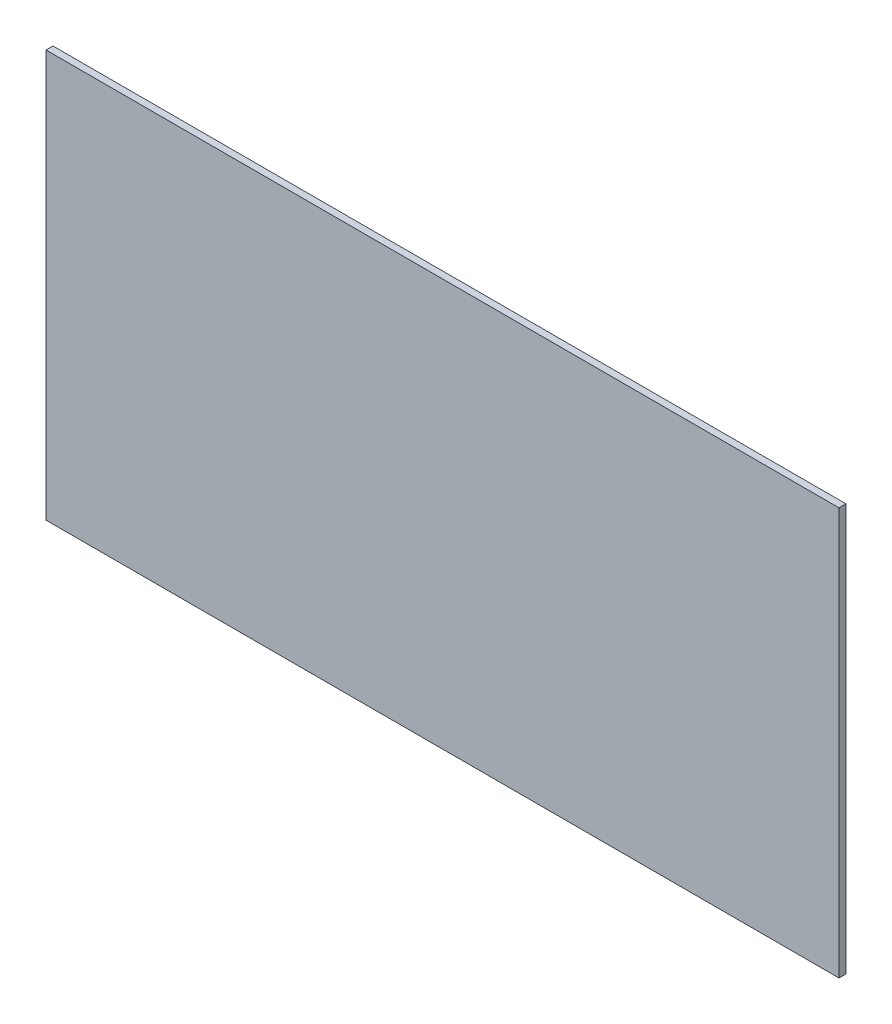
ISO-10303-21;
HEADER;
FILE_DESCRIPTION(('STEP AP214'),'2;1');
FILE_NAME('part.step','',(''),(''),'','','');
FILE_SCHEMA(('AUTOMOTIVE_DESIGN { 1 0 10303 214 1 1 1 1 }'));
ENDSEC;
DATA;
#1=APPLICATION_CONTEXT('core data for automotive mechanical design processes');
#2=APPLICATION_PROTOCOL_DEFINITION('international standard','automotive_design',2000,#1);
#3=PRODUCT_CONTEXT('',#1,'mechanical');
#4=PRODUCT('Part','Part','',(#3));
#5=PRODUCT_RELATED_PRODUCT_CATEGORY('part','',(#4));
#6=PRODUCT_DEFINITION_FORMATION('','',#4);
#7=PRODUCT_DEFINITION_CONTEXT('part definition',#1,'design');
#8=PRODUCT_DEFINITION('design','',#6,#7);
#9=PRODUCT_DEFINITION_SHAPE('','',#8);
#10=(LENGTH_UNIT() NAMED_UNIT(*) SI_UNIT(.MILLI.,.METRE.));
#11=(NAMED_UNIT(*) PLANE_ANGLE_UNIT() SI_UNIT($,.RADIAN.));
#12=(NAMED_UNIT(*) SI_UNIT($,.STERADIAN.) SOLID_ANGLE_UNIT());
#13=UNCERTAINTY_MEASURE_WITH_UNIT(LENGTH_MEASURE(1.E-05),#10,'distance_accuracy_value','');
#14=(GEOMETRIC_REPRESENTATION_CONTEXT(3) GLOBAL_UNCERTAINTY_ASSIGNED_CONTEXT((#13)) GLOBAL_UNIT_ASSIGNED_CONTEXT((#10,
#11,#12)) REPRESENTATION_CONTEXT('',''));
#15=CARTESIAN_POINT('',(0.,0.,0.));
#16=DIRECTION('',(0.,0.,1.));
#17=DIRECTION('',(1.,0.,0.));
#18=AXIS2_PLACEMENT_3D('',#15,#16,#17);
#19=CARTESIAN_POINT('',(171.45,26.67,0.41148));
#20=DIRECTION('',(0.,0.,-1.));
#21=DIRECTION('',(-1.,0.,0.));
#22=AXIS2_PLACEMENT_3D('',#19,#20,#21);
#23=PLANE('',#22);
#24=DIRECTION('',(1.,0.,0.));
#25=VECTOR('',#24,1.);
#26=CARTESIAN_POINT('',(171.45,50.8,0.41148));
#27=LINE('',#26,#25);
#28=CARTESIAN_POINT('',(171.45,50.8,0.41148));
#29=VERTEX_POINT('',#28);
#30=CARTESIAN_POINT('',(124.46,50.8,0.41148));
#31=VERTEX_POINT('',#30);
#32=EDGE_CURVE('E55',#29,#31,#27,.F.);
#33=ORIENTED_EDGE('',*,*,#32,.T.);
#34=DIRECTION('',(0.,1.,0.));
#35=VECTOR('',#34,1.);
#36=CARTESIAN_POINT('',(124.46,50.8,0.41148));
#37=LINE('',#36,#35);
#38=CARTESIAN_POINT('',(124.46,26.67,0.41148));
#39=VERTEX_POINT('',#38);
#40=EDGE_CURVE('E57',#31,#39,#37,.F.);
#41=ORIENTED_EDGE('',*,*,#40,.T.);
#42=DIRECTION('',(1.,0.,0.));
#43=VECTOR('',#42,1.);
#44=CARTESIAN_POINT('',(124.46,26.67,0.41148));
#45=LINE('',#44,#43);
#46=CARTESIAN_POINT('',(171.45,26.67,0.41148));
#47=VERTEX_POINT('',#46);
#48=EDGE_CURVE('E20',#39,#47,#45,.T.);
#49=ORIENTED_EDGE('',*,*,#48,.T.);
#50=DIRECTION('',(0.,1.,0.));
#51=VECTOR('',#50,1.);
#52=CARTESIAN_POINT('',(171.45,26.67,0.41148));
#53=LINE('',#52,#51);
#54=EDGE_CURVE('E80',#47,#29,#53,.T.);
#55=ORIENTED_EDGE('',*,*,#54,.T.);
#56=EDGE_LOOP('',(#33,#41,#49,#55));
#57=FACE_BOUND('',#56,.T.);
#58=ADVANCED_FACE('F17',(#57),#23,.F.);
#59=CARTESIAN_POINT('',(124.46,26.67,0.));
#60=DIRECTION('',(0.,1.,0.));
#61=DIRECTION('',(0.,0.,1.));
#62=AXIS2_PLACEMENT_3D('',#59,#60,#61);
#63=PLANE('',#62);
#64=DIRECTION('',(0.,0.,1.));
#65=VECTOR('',#64,1.);
#66=CARTESIAN_POINT('',(171.45,26.67,0.));
#67=LINE('',#66,#65);
#68=CARTESIAN_POINT('',(171.45,26.67,0.));
#69=VERTEX_POINT('',#68);
#70=EDGE_CURVE('E68',#69,#47,#67,.T.);
#71=ORIENTED_EDGE('',*,*,#70,.T.);
#72=ORIENTED_EDGE('',*,*,#48,.F.);
#73=DIRECTION('',(0.,0.,-1.));
#74=VECTOR('',#73,1.);
#75=CARTESIAN_POINT('',(124.46,26.67,0.));
#76=LINE('',#75,#74);
#77=CARTESIAN_POINT('',(124.46,26.67,0.));
#78=VERTEX_POINT('',#77);
#79=EDGE_CURVE('E63',#39,#78,#76,.T.);
#80=ORIENTED_EDGE('',*,*,#79,.T.);
#81=DIRECTION('',(-1.,0.,0.));
#82=VECTOR('',#81,1.);
#83=CARTESIAN_POINT('',(171.45,26.67,0.));
#84=LINE('',#83,#82);
#85=EDGE_CURVE('E83',#69,#78,#84,.T.);
#86=ORIENTED_EDGE('',*,*,#85,.F.);
#87=EDGE_LOOP('',(#71,#72,#80,#86));
#88=FACE_BOUND('',#87,.T.);
#89=ADVANCED_FACE('F65',(#88),#63,.F.);
#90=CARTESIAN_POINT('',(124.46,50.8,0.));
#91=DIRECTION('',(1.,0.,0.));
#92=DIRECTION('',(0.,0.,-1.));
#93=AXIS2_PLACEMENT_3D('',#90,#91,#92);
#94=PLANE('',#93);
#95=ORIENTED_EDGE('',*,*,#79,.F.);
#96=ORIENTED_EDGE('',*,*,#40,.F.);
#97=DIRECTION('',(0.,0.,-1.));
#98=VECTOR('',#97,1.);
#99=CARTESIAN_POINT('',(124.46,50.8,0.));
#100=LINE('',#99,#98);
#101=CARTESIAN_POINT('',(124.46,50.8,0.));
#102=VERTEX_POINT('',#101);
#103=EDGE_CURVE('E75',#31,#102,#100,.T.);
#104=ORIENTED_EDGE('',*,*,#103,.T.);
#105=DIRECTION('',(0.,1.,0.));
#106=VECTOR('',#105,1.);
#107=CARTESIAN_POINT('',(124.46,26.67,0.));
#108=LINE('',#107,#106);
#109=EDGE_CURVE('E72',#78,#102,#108,.T.);
#110=ORIENTED_EDGE('',*,*,#109,.F.);
#111=EDGE_LOOP('',(#95,#96,#104,#110));
#112=FACE_BOUND('',#111,.T.);
#113=ADVANCED_FACE('F70',(#112),#94,.F.);
#114=CARTESIAN_POINT('',(171.45,50.8,0.));
#115=DIRECTION('',(0.,-1.,0.));
#116=DIRECTION('',(0.,0.,-1.));
#117=AXIS2_PLACEMENT_3D('',#114,#115,#116);
#118=PLANE('',#117);
#119=ORIENTED_EDGE('',*,*,#103,.F.);
#120=ORIENTED_EDGE('',*,*,#32,.F.);
#121=DIRECTION('',(0.,0.,1.));
#122=VECTOR('',#121,1.);
#123=CARTESIAN_POINT('',(171.45,50.8,0.));
#124=LINE('',#123,#122);
#125=CARTESIAN_POINT('',(171.45,50.8,0.));
#126=VERTEX_POINT('',#125);
#127=EDGE_CURVE('E35',#29,#126,#124,.F.);
#128=ORIENTED_EDGE('',*,*,#127,.T.);
#129=DIRECTION('',(-1.,0.,0.));
#130=VECTOR('',#129,1.);
#131=CARTESIAN_POINT('',(171.45,50.8,0.));
#132=LINE('',#131,#130);
#133=EDGE_CURVE('E26',#102,#126,#132,.F.);
#134=ORIENTED_EDGE('',*,*,#133,.F.);
#135=EDGE_LOOP('',(#119,#120,#128,#134));
#136=FACE_BOUND('',#135,.T.);
#137=ADVANCED_FACE('F89',(#136),#118,.F.);
#138=CARTESIAN_POINT('',(171.45,26.67,0.));
#139=DIRECTION('',(-1.,0.,0.));
#140=DIRECTION('',(0.,0.,1.));
#141=AXIS2_PLACEMENT_3D('',#138,#139,#140);
#142=PLANE('',#141);
#143=ORIENTED_EDGE('',*,*,#127,.F.);
#144=ORIENTED_EDGE('',*,*,#54,.F.);
#145=ORIENTED_EDGE('',*,*,#70,.F.);
#146=DIRECTION('',(0.,1.,0.));
#147=VECTOR('',#146,1.);
#148=CARTESIAN_POINT('',(171.45,26.67,0.));
#149=LINE('',#148,#147);
#150=EDGE_CURVE('E11',#126,#69,#149,.F.);
#151=ORIENTED_EDGE('',*,*,#150,.F.);
#152=EDGE_LOOP('',(#143,#144,#145,#151));
#153=FACE_BOUND('',#152,.T.);
#154=ADVANCED_FACE('F91',(#153),#142,.F.);
#155=CARTESIAN_POINT('',(171.45,26.67,0.));
#156=DIRECTION('',(0.,0.,-1.));
#157=DIRECTION('',(-1.,0.,0.));
#158=AXIS2_PLACEMENT_3D('',#155,#156,#157);
#159=PLANE('',#158);
#160=ORIENTED_EDGE('',*,*,#133,.T.);
#161=ORIENTED_EDGE('',*,*,#150,.T.);
#162=ORIENTED_EDGE('',*,*,#85,.T.);
#163=ORIENTED_EDGE('',*,*,#109,.T.);
#164=EDGE_LOOP('',(#160,#161,#162,#163));
#165=FACE_BOUND('',#164,.T.);
#166=ADVANCED_FACE('F88',(#165),#159,.T.);
#167=CLOSED_SHELL('',(#58,#89,#113,#137,#154,#166));
#168=MANIFOLD_SOLID_BREP('B1',#167);
#169=ADVANCED_BREP_SHAPE_REPRESENTATION('',(#18,#168),#14);
#170=SHAPE_DEFINITION_REPRESENTATION(#9,#169);
ENDSEC;
END-ISO-10303-21;
